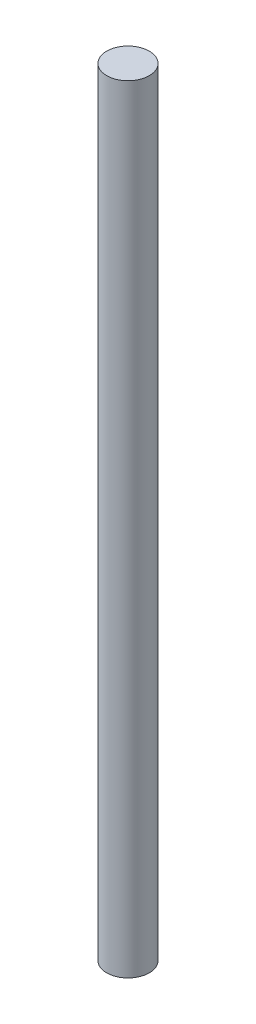
ISO-10303-21;
HEADER;
FILE_DESCRIPTION(('STEP AP214'),'2;1');
FILE_NAME('part.step','',(''),(''),'','','');
FILE_SCHEMA(('AUTOMOTIVE_DESIGN { 1 0 10303 214 1 1 1 1 }'));
ENDSEC;
DATA;
#1=APPLICATION_CONTEXT('core data for automotive mechanical design processes');
#2=APPLICATION_PROTOCOL_DEFINITION('international standard','automotive_design',2000,#1);
#3=PRODUCT_CONTEXT('',#1,'mechanical');
#4=PRODUCT('Part','Part','',(#3));
#5=PRODUCT_RELATED_PRODUCT_CATEGORY('part','',(#4));
#6=PRODUCT_DEFINITION_FORMATION('','',#4);
#7=PRODUCT_DEFINITION_CONTEXT('part definition',#1,'design');
#8=PRODUCT_DEFINITION('design','',#6,#7);
#9=PRODUCT_DEFINITION_SHAPE('','',#8);
#10=(LENGTH_UNIT() NAMED_UNIT(*) SI_UNIT(.MILLI.,.METRE.));
#11=(NAMED_UNIT(*) PLANE_ANGLE_UNIT() SI_UNIT($,.RADIAN.));
#12=(NAMED_UNIT(*) SI_UNIT($,.STERADIAN.) SOLID_ANGLE_UNIT());
#13=UNCERTAINTY_MEASURE_WITH_UNIT(LENGTH_MEASURE(1.E-05),#10,'distance_accuracy_value','');
#14=(GEOMETRIC_REPRESENTATION_CONTEXT(3) GLOBAL_UNCERTAINTY_ASSIGNED_CONTEXT((#13)) GLOBAL_UNIT_ASSIGNED_CONTEXT((#10,
#11,#12)) REPRESENTATION_CONTEXT('',''));
#15=CARTESIAN_POINT('',(0.,0.,0.));
#16=DIRECTION('',(0.,0.,1.));
#17=DIRECTION('',(1.,0.,0.));
#18=AXIS2_PLACEMENT_3D('',#15,#16,#17);
#19=CARTESIAN_POINT('',(0.,73.,0.));
#20=DIRECTION('',(0.,-1.,0.));
#21=DIRECTION('',(0.,0.,-1.));
#22=AXIS2_PLACEMENT_3D('',#19,#20,#21);
#23=CYLINDRICAL_SURFACE('',#22,2.);
#24=CARTESIAN_POINT('',(0.,73.,0.));
#25=DIRECTION('',(0.,1.,0.));
#26=DIRECTION('',(0.,0.,1.));
#27=AXIS2_PLACEMENT_3D('',#24,#25,#26);
#28=CIRCLE('',#27,2.);
#29=CARTESIAN_POINT('',(0.,73.,2.));
#30=VERTEX_POINT('',#29);
#31=EDGE_CURVE('E10',#30,#30,#28,.T.);
#32=ORIENTED_EDGE('',*,*,#31,.F.);
#33=EDGE_LOOP('',(#32));
#34=FACE_BOUND('',#33,.T.);
#35=CARTESIAN_POINT('',(0.,0.,0.));
#36=DIRECTION('',(0.,1.,0.));
#37=DIRECTION('',(0.,0.,1.));
#38=AXIS2_PLACEMENT_3D('',#35,#36,#37);
#39=CIRCLE('',#38,2.);
#40=CARTESIAN_POINT('',(0.,0.,2.));
#41=VERTEX_POINT('',#40);
#42=EDGE_CURVE('E35',#41,#41,#39,.T.);
#43=ORIENTED_EDGE('',*,*,#42,.T.);
#44=EDGE_LOOP('',(#43));
#45=FACE_BOUND('',#44,.T.);
#46=ADVANCED_FACE('F32',(#34,#45),#23,.T.);
#47=CARTESIAN_POINT('',(0.,73.,0.));
#48=DIRECTION('',(0.,1.,0.));
#49=DIRECTION('',(0.,0.,1.));
#50=AXIS2_PLACEMENT_3D('',#47,#48,#49);
#51=PLANE('',#50);
#52=ORIENTED_EDGE('',*,*,#31,.T.);
#53=EDGE_LOOP('',(#52));
#54=FACE_BOUND('',#53,.T.);
#55=ADVANCED_FACE('F47',(#54),#51,.T.);
#56=CARTESIAN_POINT('',(0.,0.,0.));
#57=DIRECTION('',(0.,1.,0.));
#58=DIRECTION('',(0.,0.,1.));
#59=AXIS2_PLACEMENT_3D('',#56,#57,#58);
#60=PLANE('',#59);
#61=ORIENTED_EDGE('',*,*,#42,.F.);
#62=EDGE_LOOP('',(#61));
#63=FACE_BOUND('',#62,.T.);
#64=ADVANCED_FACE('F45',(#63),#60,.F.);
#65=CLOSED_SHELL('',(#46,#55,#64));
#66=MANIFOLD_SOLID_BREP('B2',#65);
#67=ADVANCED_BREP_SHAPE_REPRESENTATION('',(#18,#66),#14);
#68=SHAPE_DEFINITION_REPRESENTATION(#9,#67);
ENDSEC;
END-ISO-10303-21;
